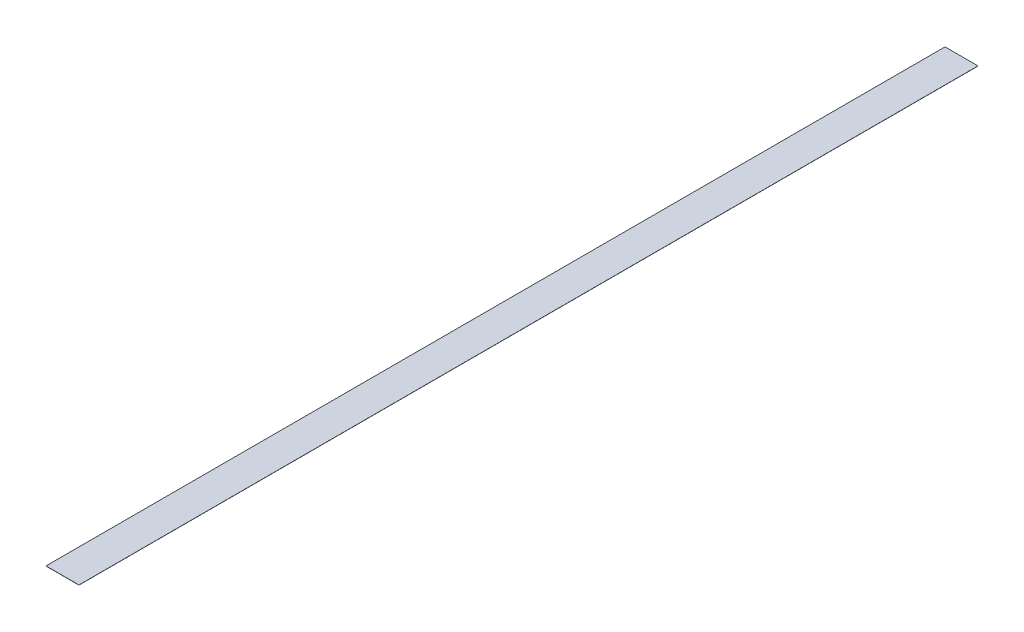
ISO-10303-21;
HEADER;
FILE_DESCRIPTION(('STEP AP214'),'2;1');
FILE_NAME('part.step','',(''),(''),'','','');
FILE_SCHEMA(('AUTOMOTIVE_DESIGN { 1 0 10303 214 1 1 1 1 }'));
ENDSEC;
DATA;
#1=APPLICATION_CONTEXT('core data for automotive mechanical design processes');
#2=APPLICATION_PROTOCOL_DEFINITION('international standard','automotive_design',2000,#1);
#3=PRODUCT_CONTEXT('',#1,'mechanical');
#4=PRODUCT('Part','Part','',(#3));
#5=PRODUCT_RELATED_PRODUCT_CATEGORY('part','',(#4));
#6=PRODUCT_DEFINITION_FORMATION('','',#4);
#7=PRODUCT_DEFINITION_CONTEXT('part definition',#1,'design');
#8=PRODUCT_DEFINITION('design','',#6,#7);
#9=PRODUCT_DEFINITION_SHAPE('','',#8);
#10=(LENGTH_UNIT() NAMED_UNIT(*) SI_UNIT(.MILLI.,.METRE.));
#11=(NAMED_UNIT(*) PLANE_ANGLE_UNIT() SI_UNIT($,.RADIAN.));
#12=(NAMED_UNIT(*) SI_UNIT($,.STERADIAN.) SOLID_ANGLE_UNIT());
#13=UNCERTAINTY_MEASURE_WITH_UNIT(LENGTH_MEASURE(1.E-05),#10,'distance_accuracy_value','');
#14=(GEOMETRIC_REPRESENTATION_CONTEXT(3) GLOBAL_UNCERTAINTY_ASSIGNED_CONTEXT((#13)) GLOBAL_UNIT_ASSIGNED_CONTEXT((#10,
#11,#12)) REPRESENTATION_CONTEXT('',''));
#15=CARTESIAN_POINT('',(0.,0.,0.));
#16=DIRECTION('',(0.,0.,1.));
#17=DIRECTION('',(1.,0.,0.));
#18=AXIS2_PLACEMENT_3D('',#15,#16,#17);
#19=CARTESIAN_POINT('',(-0.01,-0.01,600.));
#20=DIRECTION('',(0.,0.,1.));
#21=DIRECTION('',(1.,0.,0.));
#22=AXIS2_PLACEMENT_3D('',#19,#20,#21);
#23=PLANE('',#22);
#24=DIRECTION('',(1.,0.,0.));
#25=VECTOR('',#24,1.);
#26=CARTESIAN_POINT('',(11.,0.1,600.));
#27=LINE('',#26,#25);
#28=CARTESIAN_POINT('',(0.,0.1,600.));
#29=VERTEX_POINT('',#28);
#30=CARTESIAN_POINT('',(22.,0.1,600.));
#31=VERTEX_POINT('',#30);
#32=EDGE_CURVE('E77',#29,#31,#27,.T.);
#33=ORIENTED_EDGE('',*,*,#32,.F.);
#34=DIRECTION('',(0.,-1.,0.));
#35=VECTOR('',#34,1.);
#36=CARTESIAN_POINT('',(0.,0.05,600.));
#37=LINE('',#36,#35);
#38=CARTESIAN_POINT('',(0.,0.,600.));
#39=VERTEX_POINT('',#38);
#40=EDGE_CURVE('E21',#29,#39,#37,.T.);
#41=ORIENTED_EDGE('',*,*,#40,.T.);
#42=DIRECTION('',(-1.,0.,0.));
#43=VECTOR('',#42,1.);
#44=CARTESIAN_POINT('',(11.,0.,600.));
#45=LINE('',#44,#43);
#46=CARTESIAN_POINT('',(22.,0.,600.));
#47=VERTEX_POINT('',#46);
#48=EDGE_CURVE('E58',#47,#39,#45,.T.);
#49=ORIENTED_EDGE('',*,*,#48,.F.);
#50=DIRECTION('',(0.,-1.,0.));
#51=VECTOR('',#50,1.);
#52=CARTESIAN_POINT('',(22.,0.05,600.));
#53=LINE('',#52,#51);
#54=EDGE_CURVE('E61',#31,#47,#53,.T.);
#55=ORIENTED_EDGE('',*,*,#54,.F.);
#56=EDGE_LOOP('',(#33,#41,#49,#55));
#57=FACE_BOUND('',#56,.T.);
#58=ADVANCED_FACE('F17',(#57),#23,.T.);
#59=CARTESIAN_POINT('',(22.,-0.01,600.01));
#60=DIRECTION('',(1.,0.,0.));
#61=DIRECTION('',(0.,0.,-1.));
#62=AXIS2_PLACEMENT_3D('',#59,#60,#61);
#63=PLANE('',#62);
#64=DIRECTION('',(0.,0.,-1.));
#65=VECTOR('',#64,1.);
#66=CARTESIAN_POINT('',(22.,0.1,300.));
#67=LINE('',#66,#65);
#68=CARTESIAN_POINT('',(22.,0.1,0.));
#69=VERTEX_POINT('',#68);
#70=EDGE_CURVE('E74',#31,#69,#67,.T.);
#71=ORIENTED_EDGE('',*,*,#70,.F.);
#72=ORIENTED_EDGE('',*,*,#54,.T.);
#73=DIRECTION('',(0.,0.,1.));
#74=VECTOR('',#73,1.);
#75=CARTESIAN_POINT('',(22.,0.,300.));
#76=LINE('',#75,#74);
#77=CARTESIAN_POINT('',(22.,0.,0.));
#78=VERTEX_POINT('',#77);
#79=EDGE_CURVE('E71',#78,#47,#76,.T.);
#80=ORIENTED_EDGE('',*,*,#79,.F.);
#81=DIRECTION('',(0.,-1.,0.));
#82=VECTOR('',#81,1.);
#83=CARTESIAN_POINT('',(22.,0.05,0.));
#84=LINE('',#83,#82);
#85=EDGE_CURVE('E53',#69,#78,#84,.T.);
#86=ORIENTED_EDGE('',*,*,#85,.F.);
#87=EDGE_LOOP('',(#71,#72,#80,#86));
#88=FACE_BOUND('',#87,.T.);
#89=ADVANCED_FACE('F70',(#88),#63,.T.);
#90=CARTESIAN_POINT('',(22.01,-0.01,0.));
#91=DIRECTION('',(0.,0.,-1.));
#92=DIRECTION('',(-1.,0.,0.));
#93=AXIS2_PLACEMENT_3D('',#90,#91,#92);
#94=PLANE('',#93);
#95=DIRECTION('',(-1.,0.,0.));
#96=VECTOR('',#95,1.);
#97=CARTESIAN_POINT('',(11.,0.1,0.));
#98=LINE('',#97,#96);
#99=CARTESIAN_POINT('',(0.,0.1,0.));
#100=VERTEX_POINT('',#99);
#101=EDGE_CURVE('E85',#69,#100,#98,.T.);
#102=ORIENTED_EDGE('',*,*,#101,.F.);
#103=ORIENTED_EDGE('',*,*,#85,.T.);
#104=DIRECTION('',(1.,0.,0.));
#105=VECTOR('',#104,1.);
#106=CARTESIAN_POINT('',(11.,0.,0.));
#107=LINE('',#106,#105);
#108=CARTESIAN_POINT('',(0.,0.,0.));
#109=VERTEX_POINT('',#108);
#110=EDGE_CURVE('E67',#109,#78,#107,.T.);
#111=ORIENTED_EDGE('',*,*,#110,.F.);
#112=DIRECTION('',(0.,1.,0.));
#113=VECTOR('',#112,1.);
#114=CARTESIAN_POINT('',(0.,0.05,0.));
#115=LINE('',#114,#113);
#116=EDGE_CURVE('E36',#109,#100,#115,.T.);
#117=ORIENTED_EDGE('',*,*,#116,.T.);
#118=EDGE_LOOP('',(#102,#103,#111,#117));
#119=FACE_BOUND('',#118,.T.);
#120=ADVANCED_FACE('F89',(#119),#94,.T.);
#121=CARTESIAN_POINT('',(22.01,0.,600.01));
#122=DIRECTION('',(0.,-1.,0.));
#123=DIRECTION('',(-1.,0.,0.));
#124=AXIS2_PLACEMENT_3D('',#121,#122,#123);
#125=PLANE('',#124);
#126=ORIENTED_EDGE('',*,*,#110,.T.);
#127=ORIENTED_EDGE('',*,*,#79,.T.);
#128=ORIENTED_EDGE('',*,*,#48,.T.);
#129=DIRECTION('',(0.,0.,1.));
#130=VECTOR('',#129,1.);
#131=CARTESIAN_POINT('',(0.,0.,300.));
#132=LINE('',#131,#130);
#133=EDGE_CURVE('E27',#109,#39,#132,.T.);
#134=ORIENTED_EDGE('',*,*,#133,.F.);
#135=EDGE_LOOP('',(#126,#127,#128,#134));
#136=FACE_BOUND('',#135,.T.);
#137=ADVANCED_FACE('F76',(#136),#125,.T.);
#138=CARTESIAN_POINT('',(-0.00999999999999891,0.1,-0.0100000000000122));
#139=DIRECTION('',(0.,1.,0.));
#140=DIRECTION('',(0.,0.,1.));
#141=AXIS2_PLACEMENT_3D('',#138,#139,#140);
#142=PLANE('',#141);
#143=ORIENTED_EDGE('',*,*,#101,.T.);
#144=DIRECTION('',(0.,0.,-1.));
#145=VECTOR('',#144,1.);
#146=CARTESIAN_POINT('',(0.,0.1,300.));
#147=LINE('',#146,#145);
#148=EDGE_CURVE('E11',#29,#100,#147,.T.);
#149=ORIENTED_EDGE('',*,*,#148,.F.);
#150=ORIENTED_EDGE('',*,*,#32,.T.);
#151=ORIENTED_EDGE('',*,*,#70,.T.);
#152=EDGE_LOOP('',(#143,#149,#150,#151));
#153=FACE_BOUND('',#152,.T.);
#154=ADVANCED_FACE('F97',(#153),#142,.T.);
#155=CARTESIAN_POINT('',(0.,-0.01,-0.01));
#156=DIRECTION('',(-1.,0.,0.));
#157=DIRECTION('',(0.,0.,1.));
#158=AXIS2_PLACEMENT_3D('',#155,#156,#157);
#159=PLANE('',#158);
#160=ORIENTED_EDGE('',*,*,#148,.T.);
#161=ORIENTED_EDGE('',*,*,#116,.F.);
#162=ORIENTED_EDGE('',*,*,#133,.T.);
#163=ORIENTED_EDGE('',*,*,#40,.F.);
#164=EDGE_LOOP('',(#160,#161,#162,#163));
#165=FACE_BOUND('',#164,.T.);
#166=ADVANCED_FACE('F19',(#165),#159,.T.);
#167=CLOSED_SHELL('',(#58,#89,#120,#137,#154,#166));
#168=MANIFOLD_SOLID_BREP('B1',#167);
#169=ADVANCED_BREP_SHAPE_REPRESENTATION('',(#18,#168),#14);
#170=SHAPE_DEFINITION_REPRESENTATION(#9,#169);
ENDSEC;
END-ISO-10303-21;
